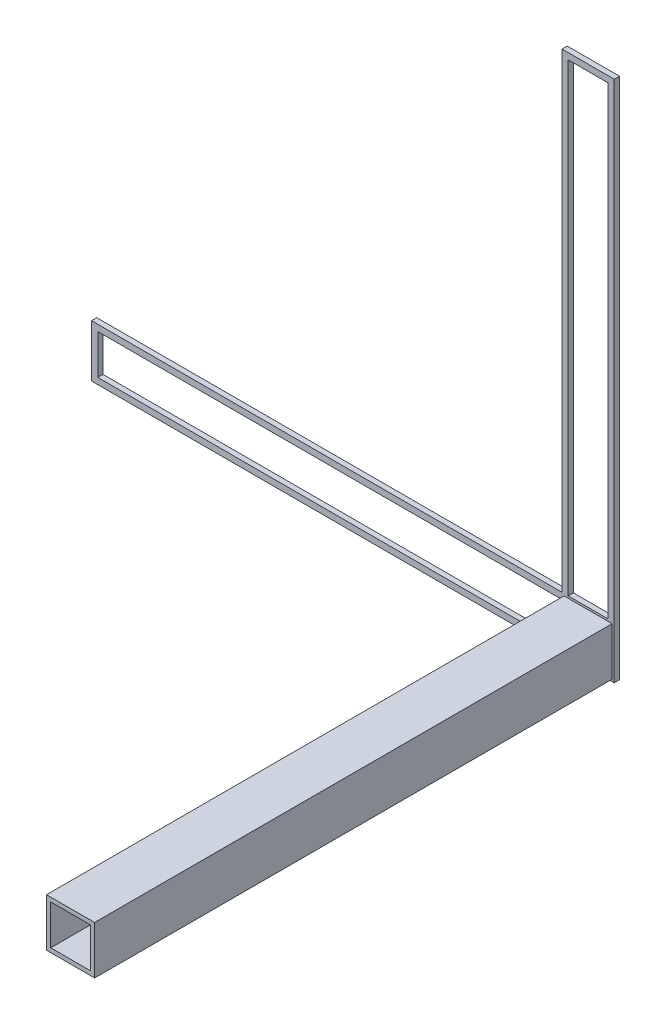
ISO-10303-21;
HEADER;
FILE_DESCRIPTION(('STEP AP214'),'2;1');
FILE_NAME('part.step','',(''),(''),'','','');
FILE_SCHEMA(('AUTOMOTIVE_DESIGN { 1 0 10303 214 1 1 1 1 }'));
ENDSEC;
DATA;
#1=APPLICATION_CONTEXT('core data for automotive mechanical design processes');
#2=APPLICATION_PROTOCOL_DEFINITION('international standard','automotive_design',2000,#1);
#3=PRODUCT_CONTEXT('',#1,'mechanical');
#4=PRODUCT('Part','Part','',(#3));
#5=PRODUCT_RELATED_PRODUCT_CATEGORY('part','',(#4));
#6=PRODUCT_DEFINITION_FORMATION('','',#4);
#7=PRODUCT_DEFINITION_CONTEXT('part definition',#1,'design');
#8=PRODUCT_DEFINITION('design','',#6,#7);
#9=PRODUCT_DEFINITION_SHAPE('','',#8);
#10=(LENGTH_UNIT() NAMED_UNIT(*) SI_UNIT(.MILLI.,.METRE.));
#11=(NAMED_UNIT(*) PLANE_ANGLE_UNIT() SI_UNIT($,.RADIAN.));
#12=(NAMED_UNIT(*) SI_UNIT($,.STERADIAN.) SOLID_ANGLE_UNIT());
#13=UNCERTAINTY_MEASURE_WITH_UNIT(LENGTH_MEASURE(1.E-05),#10,'distance_accuracy_value','');
#14=(GEOMETRIC_REPRESENTATION_CONTEXT(3) GLOBAL_UNCERTAINTY_ASSIGNED_CONTEXT((#13)) GLOBAL_UNIT_ASSIGNED_CONTEXT((#10,
#11,#12)) REPRESENTATION_CONTEXT('',''));
#15=CARTESIAN_POINT('',(0.,0.,0.));
#16=DIRECTION('',(0.,0.,1.));
#17=DIRECTION('',(1.,0.,0.));
#18=AXIS2_PLACEMENT_3D('',#15,#16,#17);
#19=CARTESIAN_POINT('',(0.,0.,1.));
#20=DIRECTION('',(0.,0.,1.));
#21=DIRECTION('',(1.,0.,0.));
#22=AXIS2_PLACEMENT_3D('',#19,#20,#21);
#23=PLANE('',#22);
#24=DIRECTION('',(0.,1.,0.));
#25=VECTOR('',#24,1.);
#26=CARTESIAN_POINT('',(16.0204081632653,-4.18367346938775,1.));
#27=LINE('',#26,#25);
#28=CARTESIAN_POINT('',(16.0204081632653,-2.98367346938775,1.));
#29=VERTEX_POINT('',#28);
#30=CARTESIAN_POINT('',(16.0204081632653,4.61632653061225,1.));
#31=VERTEX_POINT('',#30);
#32=EDGE_CURVE('E334',#29,#31,#27,.T.);
#33=ORIENTED_EDGE('',*,*,#32,.F.);
#34=DIRECTION('',(1.,0.,0.));
#35=VECTOR('',#34,1.);
#36=CARTESIAN_POINT('',(-73.9795918367347,-2.98367346938775,1.));
#37=LINE('',#36,#35);
#38=CARTESIAN_POINT('',(-72.7795918367347,-2.98367346938775,1.));
#39=VERTEX_POINT('',#38);
#40=EDGE_CURVE('E341',#39,#29,#37,.T.);
#41=ORIENTED_EDGE('',*,*,#40,.F.);
#42=DIRECTION('',(0.,-1.,0.));
#43=VECTOR('',#42,1.);
#44=CARTESIAN_POINT('',(-72.7795918367347,5.81632653061225,1.));
#45=LINE('',#44,#43);
#46=CARTESIAN_POINT('',(-72.7795918367347,4.61632653061225,1.));
#47=VERTEX_POINT('',#46);
#48=EDGE_CURVE('E345',#47,#39,#45,.T.);
#49=ORIENTED_EDGE('',*,*,#48,.F.);
#50=DIRECTION('',(1.,0.,0.));
#51=VECTOR('',#50,1.);
#52=CARTESIAN_POINT('',(-73.9795918367347,4.61632653061225,1.));
#53=LINE('',#52,#51);
#54=EDGE_CURVE('E351',#47,#31,#53,.T.);
#55=ORIENTED_EDGE('',*,*,#54,.T.);
#56=EDGE_LOOP('',(#33,#41,#49,#55));
#57=FACE_BOUND('',#56,.T.);
#58=CARTESIAN_POINT('',(16.0204081632653,5.81632653061225,1.));
#59=VERTEX_POINT('',#58);
#60=CARTESIAN_POINT('',(16.0204081632653,95.8163265306123,1.));
#61=VERTEX_POINT('',#60);
#62=EDGE_CURVE('E353',#59,#61,#27,.T.);
#63=ORIENTED_EDGE('',*,*,#62,.F.);
#64=DIRECTION('',(1.,0.,0.));
#65=VECTOR('',#64,1.);
#66=CARTESIAN_POINT('',(-73.9795918367347,5.81632653061225,1.));
#67=LINE('',#66,#65);
#68=CARTESIAN_POINT('',(-73.9795918367347,5.81632653061225,1.));
#69=VERTEX_POINT('',#68);
#70=EDGE_CURVE('E405',#69,#59,#67,.T.);
#71=ORIENTED_EDGE('',*,*,#70,.F.);
#72=DIRECTION('',(0.,-1.,0.));
#73=VECTOR('',#72,1.);
#74=CARTESIAN_POINT('',(-73.9795918367347,5.81632653061225,1.));
#75=LINE('',#74,#73);
#76=CARTESIAN_POINT('',(-73.9795918367347,-4.18367346938775,1.));
#77=VERTEX_POINT('',#76);
#78=EDGE_CURVE('E400',#69,#77,#75,.T.);
#79=ORIENTED_EDGE('',*,*,#78,.T.);
#80=DIRECTION('',(-1.,0.,0.));
#81=VECTOR('',#80,1.);
#82=CARTESIAN_POINT('',(26.0204081632653,-4.18367346938775,1.));
#83=LINE('',#82,#81);
#84=CARTESIAN_POINT('',(26.0204081632653,-4.18367346938775,1.));
#85=VERTEX_POINT('',#84);
#86=EDGE_CURVE('E352',#85,#77,#83,.T.);
#87=ORIENTED_EDGE('',*,*,#86,.F.);
#88=DIRECTION('',(0.,1.,0.));
#89=VECTOR('',#88,1.);
#90=CARTESIAN_POINT('',(26.0204081632653,-4.18367346938775,1.));
#91=LINE('',#90,#89);
#92=CARTESIAN_POINT('',(26.0204081632653,95.8163265306123,1.));
#93=VERTEX_POINT('',#92);
#94=EDGE_CURVE('E371',#85,#93,#91,.T.);
#95=ORIENTED_EDGE('',*,*,#94,.T.);
#96=DIRECTION('',(-1.,0.,0.));
#97=VECTOR('',#96,1.);
#98=CARTESIAN_POINT('',(26.0204081632653,95.8163265306123,1.));
#99=LINE('',#98,#97);
#100=EDGE_CURVE('E357',#93,#61,#99,.T.);
#101=ORIENTED_EDGE('',*,*,#100,.T.);
#102=EDGE_LOOP('',(#63,#71,#79,#87,#95,#101));
#103=FACE_BOUND('',#102,.T.);
#104=DIRECTION('',(0.,1.,0.));
#105=VECTOR('',#104,1.);
#106=CARTESIAN_POINT('',(24.8204081632653,-4.18367346938775,1.));
#107=LINE('',#106,#105);
#108=CARTESIAN_POINT('',(24.8204081632653,5.81632653061225,1.));
#109=VERTEX_POINT('',#108);
#110=CARTESIAN_POINT('',(24.8204081632653,94.6163265306123,1.));
#111=VERTEX_POINT('',#110);
#112=EDGE_CURVE('E447',#109,#111,#107,.T.);
#113=ORIENTED_EDGE('',*,*,#112,.F.);
#114=CARTESIAN_POINT('',(17.2204081632653,5.81632653061225,1.));
#115=VERTEX_POINT('',#114);
#116=EDGE_CURVE('E403',#115,#109,#67,.T.);
#117=ORIENTED_EDGE('',*,*,#116,.F.);
#118=DIRECTION('',(0.,1.,0.));
#119=VECTOR('',#118,1.);
#120=CARTESIAN_POINT('',(17.2204081632653,-4.18367346938775,1.));
#121=LINE('',#120,#119);
#122=CARTESIAN_POINT('',(17.2204081632653,94.6163265306123,1.));
#123=VERTEX_POINT('',#122);
#124=EDGE_CURVE('E438',#115,#123,#121,.T.);
#125=ORIENTED_EDGE('',*,*,#124,.T.);
#126=DIRECTION('',(-1.,0.,0.));
#127=VECTOR('',#126,1.);
#128=CARTESIAN_POINT('',(26.0204081632653,94.6163265306123,1.));
#129=LINE('',#128,#127);
#130=EDGE_CURVE('E707',#111,#123,#129,.T.);
#131=ORIENTED_EDGE('',*,*,#130,.F.);
#132=EDGE_LOOP('',(#113,#117,#125,#131));
#133=FACE_BOUND('',#132,.T.);
#134=DIRECTION('',(1.,0.,0.));
#135=VECTOR('',#134,1.);
#136=CARTESIAN_POINT('',(17.2204081632653,-3.78367346938775,1.));
#137=LINE('',#136,#135);
#138=CARTESIAN_POINT('',(16.4204081632653,-3.78367346938775,1.));
#139=VERTEX_POINT('',#138);
#140=CARTESIAN_POINT('',(25.6204081632653,-3.78367346938775,1.));
#141=VERTEX_POINT('',#140);
#142=EDGE_CURVE('E690',#139,#141,#137,.T.);
#143=ORIENTED_EDGE('',*,*,#142,.F.);
#144=DIRECTION('',(0.,-1.,0.));
#145=VECTOR('',#144,1.);
#146=CARTESIAN_POINT('',(16.4204081632653,4.61632653061225,1.));
#147=LINE('',#146,#145);
#148=CARTESIAN_POINT('',(16.4204081632653,5.41632653061225,1.));
#149=VERTEX_POINT('',#148);
#150=EDGE_CURVE('E684',#149,#139,#147,.T.);
#151=ORIENTED_EDGE('',*,*,#150,.F.);
#152=DIRECTION('',(-1.,0.,0.));
#153=VECTOR('',#152,1.);
#154=CARTESIAN_POINT('',(17.2204081632653,5.41632653061225,1.));
#155=LINE('',#154,#153);
#156=CARTESIAN_POINT('',(25.6204081632653,5.41632653061225,1.));
#157=VERTEX_POINT('',#156);
#158=EDGE_CURVE('E667',#157,#149,#155,.T.);
#159=ORIENTED_EDGE('',*,*,#158,.F.);
#160=DIRECTION('',(0.,1.,0.));
#161=VECTOR('',#160,1.);
#162=CARTESIAN_POINT('',(25.6204081632653,4.61632653061225,1.));
#163=LINE('',#162,#161);
#164=EDGE_CURVE('E679',#141,#157,#163,.T.);
#165=ORIENTED_EDGE('',*,*,#164,.F.);
#166=EDGE_LOOP('',(#143,#151,#159,#165));
#167=FACE_BOUND('',#166,.T.);
#168=ADVANCED_FACE('F205',(#57,#103,#133,#167),#23,.T.);
#169=CARTESIAN_POINT('',(24.8204081632653,-4.18367346938775,1.));
#170=DIRECTION('',(-1.,0.,0.));
#171=DIRECTION('',(0.,0.,1.));
#172=AXIS2_PLACEMENT_3D('',#169,#170,#171);
#173=PLANE('',#172);
#174=DIRECTION('',(0.,0.,-1.));
#175=VECTOR('',#174,1.);
#176=CARTESIAN_POINT('',(24.8204081632653,-2.98367346938775,1.));
#177=LINE('',#176,#175);
#178=CARTESIAN_POINT('',(24.8204081632653,-2.98367346938775,100.));
#179=VERTEX_POINT('',#178);
#180=CARTESIAN_POINT('',(24.8204081632653,-2.98367346938775,0.));
#181=VERTEX_POINT('',#180);
#182=EDGE_CURVE('E448',#179,#181,#177,.T.);
#183=ORIENTED_EDGE('',*,*,#182,.F.);
#184=DIRECTION('',(0.,1.,0.));
#185=VECTOR('',#184,1.);
#186=CARTESIAN_POINT('',(24.8204081632653,4.61632653061225,100.));
#187=LINE('',#186,#185);
#188=CARTESIAN_POINT('',(24.8204081632653,4.61632653061225,100.));
#189=VERTEX_POINT('',#188);
#190=EDGE_CURVE('E695',#179,#189,#187,.T.);
#191=ORIENTED_EDGE('',*,*,#190,.T.);
#192=DIRECTION('',(0.,0.,-1.));
#193=VECTOR('',#192,1.);
#194=CARTESIAN_POINT('',(24.8204081632653,4.61632653061225,1.));
#195=LINE('',#194,#193);
#196=CARTESIAN_POINT('',(24.8204081632653,4.61632653061225,0.));
#197=VERTEX_POINT('',#196);
#198=EDGE_CURVE('E383',#189,#197,#195,.T.);
#199=ORIENTED_EDGE('',*,*,#198,.T.);
#200=DIRECTION('',(0.,1.,0.));
#201=VECTOR('',#200,1.);
#202=CARTESIAN_POINT('',(24.8204081632653,-4.18367346938775,0.));
#203=LINE('',#202,#201);
#204=EDGE_CURVE('E432',#181,#197,#203,.T.);
#205=ORIENTED_EDGE('',*,*,#204,.F.);
#206=EDGE_LOOP('',(#183,#191,#199,#205));
#207=FACE_BOUND('',#206,.T.);
#208=ADVANCED_FACE('F497',(#207),#173,.T.);
#209=CARTESIAN_POINT('',(26.0204081632653,-2.98367346938775,1.));
#210=DIRECTION('',(0.,-1.,0.));
#211=DIRECTION('',(1.,0.,0.));
#212=AXIS2_PLACEMENT_3D('',#209,#210,#211);
#213=PLANE('',#212);
#214=DIRECTION('',(-1.,0.,0.));
#215=VECTOR('',#214,1.);
#216=CARTESIAN_POINT('',(26.0204081632653,-2.98367346938775,0.));
#217=LINE('',#216,#215);
#218=CARTESIAN_POINT('',(17.2204081632653,-2.98367346938775,0.));
#219=VERTEX_POINT('',#218);
#220=EDGE_CURVE('E444',#181,#219,#217,.T.);
#221=ORIENTED_EDGE('',*,*,#220,.T.);
#222=DIRECTION('',(0.,0.,-1.));
#223=VECTOR('',#222,1.);
#224=CARTESIAN_POINT('',(17.2204081632653,-2.98367346938775,1.));
#225=LINE('',#224,#223);
#226=CARTESIAN_POINT('',(17.2204081632653,-2.98367346938775,100.));
#227=VERTEX_POINT('',#226);
#228=EDGE_CURVE('E451',#227,#219,#225,.T.);
#229=ORIENTED_EDGE('',*,*,#228,.F.);
#230=DIRECTION('',(1.,0.,0.));
#231=VECTOR('',#230,1.);
#232=CARTESIAN_POINT('',(17.2204081632653,-2.98367346938775,100.));
#233=LINE('',#232,#231);
#234=EDGE_CURVE('E739',#227,#179,#233,.T.);
#235=ORIENTED_EDGE('',*,*,#234,.T.);
#236=ORIENTED_EDGE('',*,*,#182,.T.);
#237=EDGE_LOOP('',(#221,#229,#235,#236));
#238=FACE_BOUND('',#237,.T.);
#239=ADVANCED_FACE('F494',(#238),#213,.F.);
#240=CARTESIAN_POINT('',(26.0204081632653,-4.18367346938775,1.));
#241=DIRECTION('',(0.,-1.,0.));
#242=DIRECTION('',(1.,0.,0.));
#243=AXIS2_PLACEMENT_3D('',#240,#241,#242);
#244=PLANE('',#243);
#245=DIRECTION('',(-1.,0.,0.));
#246=VECTOR('',#245,1.);
#247=CARTESIAN_POINT('',(26.0204081632653,-4.18367346938775,0.));
#248=LINE('',#247,#246);
#249=CARTESIAN_POINT('',(26.0204081632653,-4.18367346938775,0.));
#250=VERTEX_POINT('',#249);
#251=CARTESIAN_POINT('',(-73.9795918367347,-4.18367346938775,0.));
#252=VERTEX_POINT('',#251);
#253=EDGE_CURVE('E369',#250,#252,#248,.T.);
#254=ORIENTED_EDGE('',*,*,#253,.F.);
#255=DIRECTION('',(0.,0.,-1.));
#256=VECTOR('',#255,1.);
#257=CARTESIAN_POINT('',(26.0204081632653,-4.18367346938775,1.));
#258=LINE('',#257,#256);
#259=EDGE_CURVE('E355',#85,#250,#258,.T.);
#260=ORIENTED_EDGE('',*,*,#259,.F.);
#261=ORIENTED_EDGE('',*,*,#86,.T.);
#262=DIRECTION('',(0.,0.,-1.));
#263=VECTOR('',#262,1.);
#264=CARTESIAN_POINT('',(-73.9795918367347,-4.18367346938775,1.));
#265=LINE('',#264,#263);
#266=EDGE_CURVE('E407',#77,#252,#265,.T.);
#267=ORIENTED_EDGE('',*,*,#266,.T.);
#268=EDGE_LOOP('',(#254,#260,#261,#267));
#269=FACE_BOUND('',#268,.T.);
#270=ADVANCED_FACE('F480',(#269),#244,.T.);
#271=CARTESIAN_POINT('',(17.2204081632653,-4.18367346938775,1.));
#272=DIRECTION('',(-1.,0.,0.));
#273=DIRECTION('',(0.,-1.,0.));
#274=AXIS2_PLACEMENT_3D('',#271,#272,#273);
#275=PLANE('',#274);
#276=DIRECTION('',(0.,0.,-1.));
#277=VECTOR('',#276,1.);
#278=CARTESIAN_POINT('',(17.2204081632653,4.61632653061225,1.));
#279=LINE('',#278,#277);
#280=CARTESIAN_POINT('',(17.2204081632653,4.61632653061225,100.));
#281=VERTEX_POINT('',#280);
#282=CARTESIAN_POINT('',(17.2204081632653,4.61632653061225,0.));
#283=VERTEX_POINT('',#282);
#284=EDGE_CURVE('E379',#281,#283,#279,.T.);
#285=ORIENTED_EDGE('',*,*,#284,.F.);
#286=DIRECTION('',(0.,-1.,0.));
#287=VECTOR('',#286,1.);
#288=CARTESIAN_POINT('',(17.2204081632653,4.61632653061225,100.));
#289=LINE('',#288,#287);
#290=EDGE_CURVE('E744',#281,#227,#289,.T.);
#291=ORIENTED_EDGE('',*,*,#290,.T.);
#292=ORIENTED_EDGE('',*,*,#228,.T.);
#293=DIRECTION('',(0.,1.,0.));
#294=VECTOR('',#293,1.);
#295=CARTESIAN_POINT('',(17.2204081632653,-4.18367346938775,0.));
#296=LINE('',#295,#294);
#297=EDGE_CURVE('E441',#219,#283,#296,.T.);
#298=ORIENTED_EDGE('',*,*,#297,.T.);
#299=EDGE_LOOP('',(#285,#291,#292,#298));
#300=FACE_BOUND('',#299,.T.);
#301=ADVANCED_FACE('F493',(#300),#275,.F.);
#302=CARTESIAN_POINT('',(16.0204081632653,-4.18367346938775,1.));
#303=DIRECTION('',(-1.,0.,0.));
#304=DIRECTION('',(0.,-1.,0.));
#305=AXIS2_PLACEMENT_3D('',#302,#303,#304);
#306=PLANE('',#305);
#307=ORIENTED_EDGE('',*,*,#32,.T.);
#308=DIRECTION('',(0.,0.,-1.));
#309=VECTOR('',#308,1.);
#310=CARTESIAN_POINT('',(16.0204081632653,4.61632653061225,1.));
#311=LINE('',#310,#309);
#312=CARTESIAN_POINT('',(16.0204081632653,4.61632653061225,0.));
#313=VERTEX_POINT('',#312);
#314=EDGE_CURVE('E213',#31,#313,#311,.T.);
#315=ORIENTED_EDGE('',*,*,#314,.T.);
#316=DIRECTION('',(0.,1.,0.));
#317=VECTOR('',#316,1.);
#318=CARTESIAN_POINT('',(16.0204081632653,-4.18367346938775,0.));
#319=LINE('',#318,#317);
#320=CARTESIAN_POINT('',(16.0204081632653,-2.98367346938775,0.));
#321=VERTEX_POINT('',#320);
#322=EDGE_CURVE('E336',#321,#313,#319,.T.);
#323=ORIENTED_EDGE('',*,*,#322,.F.);
#324=DIRECTION('',(0.,0.,-1.));
#325=VECTOR('',#324,1.);
#326=CARTESIAN_POINT('',(16.0204081632653,-2.98367346938775,1.));
#327=LINE('',#326,#325);
#328=EDGE_CURVE('E331',#29,#321,#327,.T.);
#329=ORIENTED_EDGE('',*,*,#328,.F.);
#330=EDGE_LOOP('',(#307,#315,#323,#329));
#331=FACE_BOUND('',#330,.T.);
#332=ADVANCED_FACE('F332',(#331),#306,.T.);
#333=CARTESIAN_POINT('',(-73.9795918367347,5.81632653061225,1.));
#334=DIRECTION('',(0.,1.,0.));
#335=DIRECTION('',(0.,0.,1.));
#336=AXIS2_PLACEMENT_3D('',#333,#334,#335);
#337=PLANE('',#336);
#338=ORIENTED_EDGE('',*,*,#116,.T.);
#339=DIRECTION('',(0.,0.,-1.));
#340=VECTOR('',#339,1.);
#341=CARTESIAN_POINT('',(24.8204081632653,5.81632653061225,1.));
#342=LINE('',#341,#340);
#343=CARTESIAN_POINT('',(24.8204081632653,5.81632653061225,0.));
#344=VERTEX_POINT('',#343);
#345=EDGE_CURVE('E338',#109,#344,#342,.T.);
#346=ORIENTED_EDGE('',*,*,#345,.T.);
#347=DIRECTION('',(1.,0.,0.));
#348=VECTOR('',#347,1.);
#349=CARTESIAN_POINT('',(-73.9795918367347,5.81632653061225,0.));
#350=LINE('',#349,#348);
#351=CARTESIAN_POINT('',(17.2204081632653,5.81632653061225,0.));
#352=VERTEX_POINT('',#351);
#353=EDGE_CURVE('E410',#352,#344,#350,.T.);
#354=ORIENTED_EDGE('',*,*,#353,.F.);
#355=DIRECTION('',(0.,0.,-1.));
#356=VECTOR('',#355,1.);
#357=CARTESIAN_POINT('',(17.2204081632653,5.81632653061225,1.));
#358=LINE('',#357,#356);
#359=EDGE_CURVE('E381',#115,#352,#358,.T.);
#360=ORIENTED_EDGE('',*,*,#359,.F.);
#361=EDGE_LOOP('',(#338,#346,#354,#360));
#362=FACE_BOUND('',#361,.T.);
#363=ADVANCED_FACE('F420',(#362),#337,.T.);
#364=CARTESIAN_POINT('',(-73.9795918367347,4.61632653061225,1.));
#365=DIRECTION('',(0.,1.,0.));
#366=DIRECTION('',(0.,0.,1.));
#367=AXIS2_PLACEMENT_3D('',#364,#365,#366);
#368=PLANE('',#367);
#369=ORIENTED_EDGE('',*,*,#198,.F.);
#370=DIRECTION('',(-1.,0.,0.));
#371=VECTOR('',#370,1.);
#372=CARTESIAN_POINT('',(17.2204081632653,4.61632653061225,100.));
#373=LINE('',#372,#371);
#374=EDGE_CURVE('E691',#189,#281,#373,.T.);
#375=ORIENTED_EDGE('',*,*,#374,.T.);
#376=ORIENTED_EDGE('',*,*,#284,.T.);
#377=DIRECTION('',(1.,0.,0.));
#378=VECTOR('',#377,1.);
#379=CARTESIAN_POINT('',(-73.9795918367347,4.61632653061225,0.));
#380=LINE('',#379,#378);
#381=EDGE_CURVE('E393',#283,#197,#380,.T.);
#382=ORIENTED_EDGE('',*,*,#381,.T.);
#383=EDGE_LOOP('',(#369,#375,#376,#382));
#384=FACE_BOUND('',#383,.T.);
#385=ADVANCED_FACE('F578',(#384),#368,.F.);
#386=CARTESIAN_POINT('',(26.0204081632653,95.8163265306123,1.));
#387=DIRECTION('',(0.,-1.,0.));
#388=DIRECTION('',(0.,0.,-1.));
#389=AXIS2_PLACEMENT_3D('',#386,#387,#388);
#390=PLANE('',#389);
#391=DIRECTION('',(-1.,0.,0.));
#392=VECTOR('',#391,1.);
#393=CARTESIAN_POINT('',(26.0204081632653,95.8163265306123,0.));
#394=LINE('',#393,#392);
#395=CARTESIAN_POINT('',(26.0204081632653,95.8163265306123,0.));
#396=VERTEX_POINT('',#395);
#397=CARTESIAN_POINT('',(16.0204081632653,95.8163265306123,0.));
#398=VERTEX_POINT('',#397);
#399=EDGE_CURVE('E363',#396,#398,#394,.T.);
#400=ORIENTED_EDGE('',*,*,#399,.T.);
#401=DIRECTION('',(0.,0.,-1.));
#402=VECTOR('',#401,1.);
#403=CARTESIAN_POINT('',(16.0204081632653,95.8163265306123,1.));
#404=LINE('',#403,#402);
#405=EDGE_CURVE('E373',#61,#398,#404,.T.);
#406=ORIENTED_EDGE('',*,*,#405,.F.);
#407=ORIENTED_EDGE('',*,*,#100,.F.);
#408=DIRECTION('',(0.,0.,-1.));
#409=VECTOR('',#408,1.);
#410=CARTESIAN_POINT('',(26.0204081632653,95.8163265306123,1.));
#411=LINE('',#410,#409);
#412=EDGE_CURVE('E376',#93,#396,#411,.T.);
#413=ORIENTED_EDGE('',*,*,#412,.T.);
#414=EDGE_LOOP('',(#400,#406,#407,#413));
#415=FACE_BOUND('',#414,.T.);
#416=ADVANCED_FACE('F466',(#415),#390,.F.);
#417=CARTESIAN_POINT('',(26.0204081632653,94.6163265306123,1.));
#418=DIRECTION('',(0.,-1.,0.));
#419=DIRECTION('',(0.,0.,-1.));
#420=AXIS2_PLACEMENT_3D('',#417,#418,#419);
#421=PLANE('',#420);
#422=DIRECTION('',(-1.,0.,0.));
#423=VECTOR('',#422,1.);
#424=CARTESIAN_POINT('',(26.0204081632653,94.6163265306123,0.));
#425=LINE('',#424,#423);
#426=CARTESIAN_POINT('',(24.8204081632653,94.6163265306123,0.));
#427=VERTEX_POINT('',#426);
#428=CARTESIAN_POINT('',(17.2204081632653,94.6163265306123,0.));
#429=VERTEX_POINT('',#428);
#430=EDGE_CURVE('E435',#427,#429,#425,.T.);
#431=ORIENTED_EDGE('',*,*,#430,.F.);
#432=DIRECTION('',(0.,0.,-1.));
#433=VECTOR('',#432,1.);
#434=CARTESIAN_POINT('',(24.8204081632653,94.6163265306123,1.));
#435=LINE('',#434,#433);
#436=EDGE_CURVE('E364',#111,#427,#435,.T.);
#437=ORIENTED_EDGE('',*,*,#436,.F.);
#438=ORIENTED_EDGE('',*,*,#130,.T.);
#439=DIRECTION('',(0.,0.,-1.));
#440=VECTOR('',#439,1.);
#441=CARTESIAN_POINT('',(17.2204081632653,94.6163265306123,1.));
#442=LINE('',#441,#440);
#443=EDGE_CURVE('E453',#123,#429,#442,.T.);
#444=ORIENTED_EDGE('',*,*,#443,.T.);
#445=EDGE_LOOP('',(#431,#437,#438,#444));
#446=FACE_BOUND('',#445,.T.);
#447=ADVANCED_FACE('F518',(#446),#421,.T.);
#448=CARTESIAN_POINT('',(0.,0.,0.));
#449=DIRECTION('',(0.,0.,1.));
#450=DIRECTION('',(1.,0.,0.));
#451=AXIS2_PLACEMENT_3D('',#448,#449,#450);
#452=PLANE('',#451);
#453=ORIENTED_EDGE('',*,*,#353,.T.);
#454=EDGE_CURVE('E270',#344,#427,#203,.T.);
#455=ORIENTED_EDGE('',*,*,#454,.T.);
#456=ORIENTED_EDGE('',*,*,#430,.T.);
#457=EDGE_CURVE('E428',#352,#429,#296,.T.);
#458=ORIENTED_EDGE('',*,*,#457,.F.);
#459=EDGE_LOOP('',(#453,#455,#456,#458));
#460=FACE_BOUND('',#459,.T.);
#461=CARTESIAN_POINT('',(-73.9795918367347,5.81632653061225,0.));
#462=VERTEX_POINT('',#461);
#463=CARTESIAN_POINT('',(16.0204081632653,5.81632653061225,0.));
#464=VERTEX_POINT('',#463);
#465=EDGE_CURVE('E404',#462,#464,#350,.T.);
#466=ORIENTED_EDGE('',*,*,#465,.T.);
#467=EDGE_CURVE('E367',#464,#398,#319,.T.);
#468=ORIENTED_EDGE('',*,*,#467,.T.);
#469=ORIENTED_EDGE('',*,*,#399,.F.);
#470=DIRECTION('',(0.,1.,0.));
#471=VECTOR('',#470,1.);
#472=CARTESIAN_POINT('',(26.0204081632653,-4.18367346938775,0.));
#473=LINE('',#472,#471);
#474=EDGE_CURVE('E361',#250,#396,#473,.T.);
#475=ORIENTED_EDGE('',*,*,#474,.F.);
#476=ORIENTED_EDGE('',*,*,#253,.T.);
#477=DIRECTION('',(0.,-1.,0.));
#478=VECTOR('',#477,1.);
#479=CARTESIAN_POINT('',(-73.9795918367347,5.81632653061225,0.));
#480=LINE('',#479,#478);
#481=EDGE_CURVE('E398',#462,#252,#480,.T.);
#482=ORIENTED_EDGE('',*,*,#481,.F.);
#483=EDGE_LOOP('',(#466,#468,#469,#475,#476,#482));
#484=FACE_BOUND('',#483,.T.);
#485=ORIENTED_EDGE('',*,*,#322,.T.);
#486=CARTESIAN_POINT('',(-72.7795918367347,4.61632653061225,0.));
#487=VERTEX_POINT('',#486);
#488=EDGE_CURVE('E346',#487,#313,#380,.T.);
#489=ORIENTED_EDGE('',*,*,#488,.F.);
#490=DIRECTION('',(0.,-1.,0.));
#491=VECTOR('',#490,1.);
#492=CARTESIAN_POINT('',(-72.7795918367347,5.81632653061225,0.));
#493=LINE('',#492,#491);
#494=CARTESIAN_POINT('',(-72.7795918367347,-2.98367346938775,0.));
#495=VERTEX_POINT('',#494);
#496=EDGE_CURVE('E389',#487,#495,#493,.T.);
#497=ORIENTED_EDGE('',*,*,#496,.T.);
#498=DIRECTION('',(1.,0.,0.));
#499=VECTOR('',#498,1.);
#500=CARTESIAN_POINT('',(-73.9795918367347,-2.98367346938775,0.));
#501=LINE('',#500,#499);
#502=EDGE_CURVE('E387',#495,#321,#501,.T.);
#503=ORIENTED_EDGE('',*,*,#502,.T.);
#504=EDGE_LOOP('',(#485,#489,#497,#503));
#505=FACE_BOUND('',#504,.T.);
#506=ORIENTED_EDGE('',*,*,#297,.F.);
#507=ORIENTED_EDGE('',*,*,#220,.F.);
#508=ORIENTED_EDGE('',*,*,#204,.T.);
#509=ORIENTED_EDGE('',*,*,#381,.F.);
#510=EDGE_LOOP('',(#506,#507,#508,#509));
#511=FACE_BOUND('',#510,.T.);
#512=ADVANCED_FACE('F426',(#460,#484,#505,#511),#452,.F.);
#513=ORIENTED_EDGE('',*,*,#124,.F.);
#514=ORIENTED_EDGE('',*,*,#359,.T.);
#515=ORIENTED_EDGE('',*,*,#457,.T.);
#516=ORIENTED_EDGE('',*,*,#443,.F.);
#517=EDGE_LOOP('',(#513,#514,#515,#516));
#518=FACE_BOUND('',#517,.T.);
#519=ADVANCED_FACE('F514',(#518),#275,.F.);
#520=ORIENTED_EDGE('',*,*,#345,.F.);
#521=ORIENTED_EDGE('',*,*,#112,.T.);
#522=ORIENTED_EDGE('',*,*,#436,.T.);
#523=ORIENTED_EDGE('',*,*,#454,.F.);
#524=EDGE_LOOP('',(#520,#521,#522,#523));
#525=FACE_BOUND('',#524,.T.);
#526=ADVANCED_FACE('F430',(#525),#173,.T.);
#527=DIRECTION('',(0.,0.,-1.));
#528=VECTOR('',#527,1.);
#529=CARTESIAN_POINT('',(16.0204081632653,5.81632653061225,1.));
#530=LINE('',#529,#528);
#531=EDGE_CURVE('E12',#59,#464,#530,.T.);
#532=ORIENTED_EDGE('',*,*,#531,.F.);
#533=ORIENTED_EDGE('',*,*,#62,.T.);
#534=ORIENTED_EDGE('',*,*,#405,.T.);
#535=ORIENTED_EDGE('',*,*,#467,.F.);
#536=EDGE_LOOP('',(#532,#533,#534,#535));
#537=FACE_BOUND('',#536,.T.);
#538=ADVANCED_FACE('F468',(#537),#306,.T.);
#539=CARTESIAN_POINT('',(26.0204081632653,-4.18367346938775,1.));
#540=DIRECTION('',(-1.,0.,0.));
#541=DIRECTION('',(0.,0.,1.));
#542=AXIS2_PLACEMENT_3D('',#539,#540,#541);
#543=PLANE('',#542);
#544=ORIENTED_EDGE('',*,*,#412,.F.);
#545=ORIENTED_EDGE('',*,*,#94,.F.);
#546=ORIENTED_EDGE('',*,*,#259,.T.);
#547=ORIENTED_EDGE('',*,*,#474,.T.);
#548=EDGE_LOOP('',(#544,#545,#546,#547));
#549=FACE_BOUND('',#548,.T.);
#550=ADVANCED_FACE('F482',(#549),#543,.F.);
#551=ORIENTED_EDGE('',*,*,#70,.T.);
#552=ORIENTED_EDGE('',*,*,#531,.T.);
#553=ORIENTED_EDGE('',*,*,#465,.F.);
#554=DIRECTION('',(0.,0.,-1.));
#555=VECTOR('',#554,1.);
#556=CARTESIAN_POINT('',(-73.9795918367347,5.81632653061225,1.));
#557=LINE('',#556,#555);
#558=EDGE_CURVE('E413',#69,#462,#557,.T.);
#559=ORIENTED_EDGE('',*,*,#558,.F.);
#560=EDGE_LOOP('',(#551,#552,#553,#559));
#561=FACE_BOUND('',#560,.T.);
#562=ADVANCED_FACE('F474',(#561),#337,.T.);
#563=CARTESIAN_POINT('',(-73.9795918367347,5.81632653061225,1.));
#564=DIRECTION('',(1.,0.,0.));
#565=DIRECTION('',(0.,0.,-1.));
#566=AXIS2_PLACEMENT_3D('',#563,#564,#565);
#567=PLANE('',#566);
#568=ORIENTED_EDGE('',*,*,#481,.T.);
#569=ORIENTED_EDGE('',*,*,#266,.F.);
#570=ORIENTED_EDGE('',*,*,#78,.F.);
#571=ORIENTED_EDGE('',*,*,#558,.T.);
#572=EDGE_LOOP('',(#568,#569,#570,#571));
#573=FACE_BOUND('',#572,.T.);
#574=ADVANCED_FACE('F207',(#573),#567,.F.);
#575=CARTESIAN_POINT('',(-72.7795918367347,5.81632653061225,1.));
#576=DIRECTION('',(1.,0.,0.));
#577=DIRECTION('',(0.,0.,-1.));
#578=AXIS2_PLACEMENT_3D('',#575,#576,#577);
#579=PLANE('',#578);
#580=ORIENTED_EDGE('',*,*,#496,.F.);
#581=DIRECTION('',(0.,0.,-1.));
#582=VECTOR('',#581,1.);
#583=CARTESIAN_POINT('',(-72.7795918367347,4.61632653061225,1.));
#584=LINE('',#583,#582);
#585=EDGE_CURVE('E396',#47,#487,#584,.T.);
#586=ORIENTED_EDGE('',*,*,#585,.F.);
#587=ORIENTED_EDGE('',*,*,#48,.T.);
#588=DIRECTION('',(0.,0.,-1.));
#589=VECTOR('',#588,1.);
#590=CARTESIAN_POINT('',(-72.7795918367347,-2.98367346938775,1.));
#591=LINE('',#590,#589);
#592=EDGE_CURVE('E261',#39,#495,#591,.T.);
#593=ORIENTED_EDGE('',*,*,#592,.T.);
#594=EDGE_LOOP('',(#580,#586,#587,#593));
#595=FACE_BOUND('',#594,.T.);
#596=ADVANCED_FACE('F551',(#595),#579,.T.);
#597=CARTESIAN_POINT('',(-73.9795918367347,-2.98367346938775,1.));
#598=DIRECTION('',(0.,1.,0.));
#599=DIRECTION('',(-1.,0.,0.));
#600=AXIS2_PLACEMENT_3D('',#597,#598,#599);
#601=PLANE('',#600);
#602=ORIENTED_EDGE('',*,*,#40,.T.);
#603=ORIENTED_EDGE('',*,*,#328,.T.);
#604=ORIENTED_EDGE('',*,*,#502,.F.);
#605=ORIENTED_EDGE('',*,*,#592,.F.);
#606=EDGE_LOOP('',(#602,#603,#604,#605));
#607=FACE_BOUND('',#606,.T.);
#608=ADVANCED_FACE('F342',(#607),#601,.T.);
#609=ORIENTED_EDGE('',*,*,#314,.F.);
#610=ORIENTED_EDGE('',*,*,#54,.F.);
#611=ORIENTED_EDGE('',*,*,#585,.T.);
#612=ORIENTED_EDGE('',*,*,#488,.T.);
#613=EDGE_LOOP('',(#609,#610,#611,#612));
#614=FACE_BOUND('',#613,.T.);
#615=ADVANCED_FACE('F568',(#614),#368,.F.);
#616=CARTESIAN_POINT('',(0.,0.,100.));
#617=DIRECTION('',(0.,0.,1.));
#618=DIRECTION('',(1.,0.,0.));
#619=AXIS2_PLACEMENT_3D('',#616,#617,#618);
#620=PLANE('',#619);
#621=DIRECTION('',(0.,-1.,0.));
#622=VECTOR('',#621,1.);
#623=CARTESIAN_POINT('',(16.4204081632653,4.61632653061225,100.));
#624=LINE('',#623,#622);
#625=CARTESIAN_POINT('',(16.4204081632653,5.41632653061225,100.));
#626=VERTEX_POINT('',#625);
#627=CARTESIAN_POINT('',(16.4204081632653,-3.78367346938775,100.));
#628=VERTEX_POINT('',#627);
#629=EDGE_CURVE('E678',#626,#628,#624,.T.);
#630=ORIENTED_EDGE('',*,*,#629,.T.);
#631=DIRECTION('',(1.,0.,0.));
#632=VECTOR('',#631,1.);
#633=CARTESIAN_POINT('',(17.2204081632653,-3.78367346938775,100.));
#634=LINE('',#633,#632);
#635=CARTESIAN_POINT('',(25.6204081632653,-3.78367346938775,100.));
#636=VERTEX_POINT('',#635);
#637=EDGE_CURVE('E753',#628,#636,#634,.T.);
#638=ORIENTED_EDGE('',*,*,#637,.T.);
#639=DIRECTION('',(0.,1.,0.));
#640=VECTOR('',#639,1.);
#641=CARTESIAN_POINT('',(25.6204081632653,4.61632653061225,100.));
#642=LINE('',#641,#640);
#643=CARTESIAN_POINT('',(25.6204081632653,5.41632653061225,100.));
#644=VERTEX_POINT('',#643);
#645=EDGE_CURVE('E754',#636,#644,#642,.T.);
#646=ORIENTED_EDGE('',*,*,#645,.T.);
#647=DIRECTION('',(-1.,0.,0.));
#648=VECTOR('',#647,1.);
#649=CARTESIAN_POINT('',(17.2204081632653,5.41632653061225,100.));
#650=LINE('',#649,#648);
#651=EDGE_CURVE('E687',#644,#626,#650,.T.);
#652=ORIENTED_EDGE('',*,*,#651,.T.);
#653=EDGE_LOOP('',(#630,#638,#646,#652));
#654=FACE_BOUND('',#653,.T.);
#655=ORIENTED_EDGE('',*,*,#234,.F.);
#656=ORIENTED_EDGE('',*,*,#290,.F.);
#657=ORIENTED_EDGE('',*,*,#374,.F.);
#658=ORIENTED_EDGE('',*,*,#190,.F.);
#659=EDGE_LOOP('',(#655,#656,#657,#658));
#660=FACE_BOUND('',#659,.T.);
#661=ADVANCED_FACE('F576',(#654,#660),#620,.T.);
#662=CARTESIAN_POINT('',(16.4204081632653,4.61632653061225,100.));
#663=DIRECTION('',(1.,0.,0.));
#664=DIRECTION('',(0.,0.,-1.));
#665=AXIS2_PLACEMENT_3D('',#662,#663,#664);
#666=PLANE('',#665);
#667=ORIENTED_EDGE('',*,*,#150,.T.);
#668=DIRECTION('',(0.,0.,-1.));
#669=VECTOR('',#668,1.);
#670=CARTESIAN_POINT('',(16.4204081632653,-3.78367346938775,100.));
#671=LINE('',#670,#669);
#672=EDGE_CURVE('E390',#628,#139,#671,.T.);
#673=ORIENTED_EDGE('',*,*,#672,.F.);
#674=ORIENTED_EDGE('',*,*,#629,.F.);
#675=DIRECTION('',(0.,0.,-1.));
#676=VECTOR('',#675,1.);
#677=CARTESIAN_POINT('',(16.4204081632653,5.41632653061225,100.));
#678=LINE('',#677,#676);
#679=EDGE_CURVE('E670',#626,#149,#678,.T.);
#680=ORIENTED_EDGE('',*,*,#679,.T.);
#681=EDGE_LOOP('',(#667,#673,#674,#680));
#682=FACE_BOUND('',#681,.T.);
#683=ADVANCED_FACE('F512',(#682),#666,.F.);
#684=CARTESIAN_POINT('',(17.2204081632653,-3.78367346938775,100.));
#685=DIRECTION('',(0.,1.,0.));
#686=DIRECTION('',(0.,0.,1.));
#687=AXIS2_PLACEMENT_3D('',#684,#685,#686);
#688=PLANE('',#687);
#689=ORIENTED_EDGE('',*,*,#142,.T.);
#690=DIRECTION('',(0.,0.,-1.));
#691=VECTOR('',#690,1.);
#692=CARTESIAN_POINT('',(25.6204081632653,-3.78367346938775,100.));
#693=LINE('',#692,#691);
#694=EDGE_CURVE('E702',#636,#141,#693,.T.);
#695=ORIENTED_EDGE('',*,*,#694,.F.);
#696=ORIENTED_EDGE('',*,*,#637,.F.);
#697=ORIENTED_EDGE('',*,*,#672,.T.);
#698=EDGE_LOOP('',(#689,#695,#696,#697));
#699=FACE_BOUND('',#698,.T.);
#700=ADVANCED_FACE('F633',(#699),#688,.F.);
#701=CARTESIAN_POINT('',(25.6204081632653,4.61632653061225,100.));
#702=DIRECTION('',(-1.,0.,0.));
#703=DIRECTION('',(0.,0.,1.));
#704=AXIS2_PLACEMENT_3D('',#701,#702,#703);
#705=PLANE('',#704);
#706=ORIENTED_EDGE('',*,*,#164,.T.);
#707=DIRECTION('',(0.,0.,-1.));
#708=VECTOR('',#707,1.);
#709=CARTESIAN_POINT('',(25.6204081632653,5.41632653061225,100.));
#710=LINE('',#709,#708);
#711=EDGE_CURVE('E220',#644,#157,#710,.T.);
#712=ORIENTED_EDGE('',*,*,#711,.F.);
#713=ORIENTED_EDGE('',*,*,#645,.F.);
#714=ORIENTED_EDGE('',*,*,#694,.T.);
#715=EDGE_LOOP('',(#706,#712,#713,#714));
#716=FACE_BOUND('',#715,.T.);
#717=ADVANCED_FACE('F642',(#716),#705,.F.);
#718=CARTESIAN_POINT('',(17.2204081632653,5.41632653061225,100.));
#719=DIRECTION('',(0.,-1.,0.));
#720=DIRECTION('',(0.,0.,-1.));
#721=AXIS2_PLACEMENT_3D('',#718,#719,#720);
#722=PLANE('',#721);
#723=ORIENTED_EDGE('',*,*,#158,.T.);
#724=ORIENTED_EDGE('',*,*,#679,.F.);
#725=ORIENTED_EDGE('',*,*,#651,.F.);
#726=ORIENTED_EDGE('',*,*,#711,.T.);
#727=EDGE_LOOP('',(#723,#724,#725,#726));
#728=FACE_BOUND('',#727,.T.);
#729=ADVANCED_FACE('F651',(#728),#722,.F.);
#730=CLOSED_SHELL('',(#168,#208,#239,#270,#301,#332,#363,#385,#416,#447,#512,#519,#526,#538,
#550,#562,#574,#596,#608,#615,#661,#683,#700,#717,#729));
#731=MANIFOLD_SOLID_BREP('B2',#730);
#732=ADVANCED_BREP_SHAPE_REPRESENTATION('',(#18,#731),#14);
#733=SHAPE_DEFINITION_REPRESENTATION(#9,#732);
ENDSEC;
END-ISO-10303-21;
